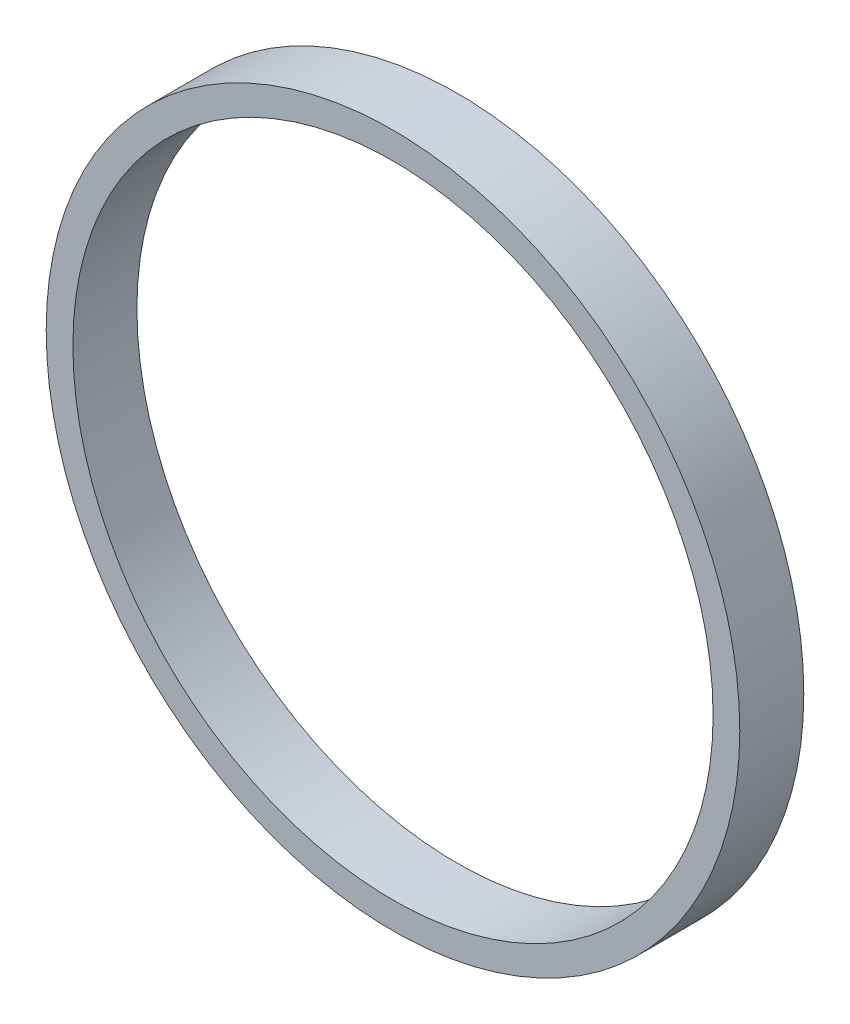
ISO-10303-21;
HEADER;
FILE_DESCRIPTION(('STEP AP214'),'2;1');
FILE_NAME('part.step','',(''),(''),'','','');
FILE_SCHEMA(('AUTOMOTIVE_DESIGN { 1 0 10303 214 1 1 1 1 }'));
ENDSEC;
DATA;
#1=APPLICATION_CONTEXT('core data for automotive mechanical design processes');
#2=APPLICATION_PROTOCOL_DEFINITION('international standard','automotive_design',2000,#1);
#3=PRODUCT_CONTEXT('',#1,'mechanical');
#4=PRODUCT('Part','Part','',(#3));
#5=PRODUCT_RELATED_PRODUCT_CATEGORY('part','',(#4));
#6=PRODUCT_DEFINITION_FORMATION('','',#4);
#7=PRODUCT_DEFINITION_CONTEXT('part definition',#1,'design');
#8=PRODUCT_DEFINITION('design','',#6,#7);
#9=PRODUCT_DEFINITION_SHAPE('','',#8);
#10=(LENGTH_UNIT() NAMED_UNIT(*) SI_UNIT(.MILLI.,.METRE.));
#11=(NAMED_UNIT(*) PLANE_ANGLE_UNIT() SI_UNIT($,.RADIAN.));
#12=(NAMED_UNIT(*) SI_UNIT($,.STERADIAN.) SOLID_ANGLE_UNIT());
#13=UNCERTAINTY_MEASURE_WITH_UNIT(LENGTH_MEASURE(1.E-05),#10,'distance_accuracy_value','');
#14=(GEOMETRIC_REPRESENTATION_CONTEXT(3) GLOBAL_UNCERTAINTY_ASSIGNED_CONTEXT((#13)) GLOBAL_UNIT_ASSIGNED_CONTEXT((#10,
#11,#12)) REPRESENTATION_CONTEXT('',''));
#15=CARTESIAN_POINT('',(0.,0.,0.));
#16=DIRECTION('',(0.,0.,1.));
#17=DIRECTION('',(1.,0.,0.));
#18=AXIS2_PLACEMENT_3D('',#15,#16,#17);
#19=CARTESIAN_POINT('',(0.,0.,6.));
#20=DIRECTION('',(0.,0.,1.));
#21=DIRECTION('',(1.,0.,0.));
#22=AXIS2_PLACEMENT_3D('',#19,#20,#21);
#23=PLANE('',#22);
#24=CARTESIAN_POINT('',(0.,0.,6.));
#25=DIRECTION('',(0.,0.,1.));
#26=DIRECTION('',(1.,0.,0.));
#27=AXIS2_PLACEMENT_3D('',#24,#25,#26);
#28=CIRCLE('',#27,32.5);
#29=CARTESIAN_POINT('',(32.5,0.,6.));
#30=VERTEX_POINT('',#29);
#31=EDGE_CURVE('E11',#30,#30,#28,.T.);
#32=ORIENTED_EDGE('',*,*,#31,.T.);
#33=EDGE_LOOP('',(#32));
#34=FACE_BOUND('',#33,.T.);
#35=CARTESIAN_POINT('',(0.,0.,6.));
#36=DIRECTION('',(0.,0.,1.));
#37=DIRECTION('',(1.,0.,0.));
#38=AXIS2_PLACEMENT_3D('',#35,#36,#37);
#39=CIRCLE('',#38,30.);
#40=CARTESIAN_POINT('',(30.,0.,6.));
#41=VERTEX_POINT('',#40);
#42=EDGE_CURVE('E48',#41,#41,#39,.T.);
#43=ORIENTED_EDGE('',*,*,#42,.F.);
#44=EDGE_LOOP('',(#43));
#45=FACE_BOUND('',#44,.T.);
#46=ADVANCED_FACE('F37',(#34,#45),#23,.T.);
#47=CARTESIAN_POINT('',(0.,0.,0.));
#48=DIRECTION('',(0.,0.,1.));
#49=DIRECTION('',(1.,0.,0.));
#50=AXIS2_PLACEMENT_3D('',#47,#48,#49);
#51=PLANE('',#50);
#52=CARTESIAN_POINT('',(0.,0.,0.));
#53=DIRECTION('',(0.,0.,1.));
#54=DIRECTION('',(1.,0.,0.));
#55=AXIS2_PLACEMENT_3D('',#52,#53,#54);
#56=CIRCLE('',#55,32.5);
#57=CARTESIAN_POINT('',(32.5,0.,0.));
#58=VERTEX_POINT('',#57);
#59=EDGE_CURVE('E41',#58,#58,#56,.T.);
#60=ORIENTED_EDGE('',*,*,#59,.F.);
#61=EDGE_LOOP('',(#60));
#62=FACE_BOUND('',#61,.T.);
#63=CARTESIAN_POINT('',(0.,0.,0.));
#64=DIRECTION('',(0.,0.,1.));
#65=DIRECTION('',(1.,0.,0.));
#66=AXIS2_PLACEMENT_3D('',#63,#64,#65);
#67=CIRCLE('',#66,30.);
#68=CARTESIAN_POINT('',(30.,0.,0.));
#69=VERTEX_POINT('',#68);
#70=EDGE_CURVE('E50',#69,#69,#67,.T.);
#71=ORIENTED_EDGE('',*,*,#70,.T.);
#72=EDGE_LOOP('',(#71));
#73=FACE_BOUND('',#72,.T.);
#74=ADVANCED_FACE('F60',(#62,#73),#51,.F.);
#75=CARTESIAN_POINT('',(0.,0.,6.));
#76=DIRECTION('',(0.,0.,-1.));
#77=DIRECTION('',(-1.,0.,0.));
#78=AXIS2_PLACEMENT_3D('',#75,#76,#77);
#79=CYLINDRICAL_SURFACE('',#78,32.5);
#80=ORIENTED_EDGE('',*,*,#31,.F.);
#81=EDGE_LOOP('',(#80));
#82=FACE_BOUND('',#81,.T.);
#83=ORIENTED_EDGE('',*,*,#59,.T.);
#84=EDGE_LOOP('',(#83));
#85=FACE_BOUND('',#84,.T.);
#86=ADVANCED_FACE('F39',(#82,#85),#79,.T.);
#87=CARTESIAN_POINT('',(0.,0.,6.));
#88=DIRECTION('',(0.,0.,-1.));
#89=DIRECTION('',(-1.,0.,0.));
#90=AXIS2_PLACEMENT_3D('',#87,#88,#89);
#91=CYLINDRICAL_SURFACE('',#90,30.);
#92=ORIENTED_EDGE('',*,*,#42,.T.);
#93=EDGE_LOOP('',(#92));
#94=FACE_BOUND('',#93,.T.);
#95=ORIENTED_EDGE('',*,*,#70,.F.);
#96=EDGE_LOOP('',(#95));
#97=FACE_BOUND('',#96,.T.);
#98=ADVANCED_FACE('F56',(#94,#97),#91,.F.);
#99=CLOSED_SHELL('',(#46,#74,#86,#98));
#100=MANIFOLD_SOLID_BREP('B2',#99);
#101=ADVANCED_BREP_SHAPE_REPRESENTATION('',(#18,#100),#14);
#102=SHAPE_DEFINITION_REPRESENTATION(#9,#101);
ENDSEC;
END-ISO-10303-21;
